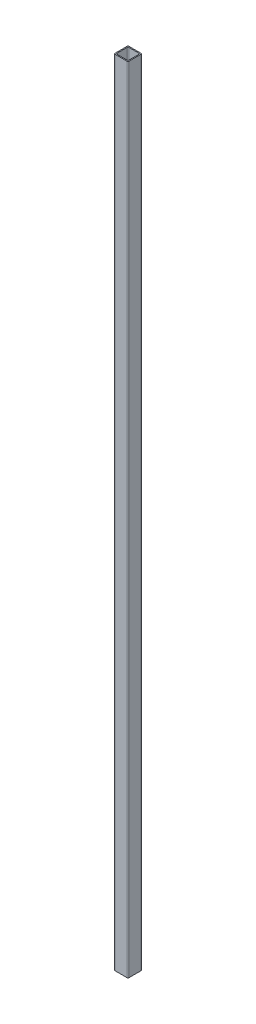
ISO-10303-21;
HEADER;
FILE_DESCRIPTION(('STEP AP214'),'2;1');
FILE_NAME('part.step','',(''),(''),'','','');
FILE_SCHEMA(('AUTOMOTIVE_DESIGN { 1 0 10303 214 1 1 1 1 }'));
ENDSEC;
DATA;
#1=APPLICATION_CONTEXT('core data for automotive mechanical design processes');
#2=APPLICATION_PROTOCOL_DEFINITION('international standard','automotive_design',2000,#1);
#3=PRODUCT_CONTEXT('',#1,'mechanical');
#4=PRODUCT('Part','Part','',(#3));
#5=PRODUCT_RELATED_PRODUCT_CATEGORY('part','',(#4));
#6=PRODUCT_DEFINITION_FORMATION('','',#4);
#7=PRODUCT_DEFINITION_CONTEXT('part definition',#1,'design');
#8=PRODUCT_DEFINITION('design','',#6,#7);
#9=PRODUCT_DEFINITION_SHAPE('','',#8);
#10=(LENGTH_UNIT() NAMED_UNIT(*) SI_UNIT(.MILLI.,.METRE.));
#11=(NAMED_UNIT(*) PLANE_ANGLE_UNIT() SI_UNIT($,.RADIAN.));
#12=(NAMED_UNIT(*) SI_UNIT($,.STERADIAN.) SOLID_ANGLE_UNIT());
#13=UNCERTAINTY_MEASURE_WITH_UNIT(LENGTH_MEASURE(1.E-05),#10,'distance_accuracy_value','');
#14=(GEOMETRIC_REPRESENTATION_CONTEXT(3) GLOBAL_UNCERTAINTY_ASSIGNED_CONTEXT((#13)) GLOBAL_UNIT_ASSIGNED_CONTEXT((#10,
#11,#12)) REPRESENTATION_CONTEXT('',''));
#15=CARTESIAN_POINT('',(0.,0.,0.));
#16=DIRECTION('',(0.,0.,1.));
#17=DIRECTION('',(1.,0.,0.));
#18=AXIS2_PLACEMENT_3D('',#15,#16,#17);
#19=CARTESIAN_POINT('',(-15.5,2000.,15.5));
#20=DIRECTION('',(0.,-1.,0.));
#21=DIRECTION('',(0.,0.,-1.));
#22=AXIS2_PLACEMENT_3D('',#19,#20,#21);
#23=CYLINDRICAL_SURFACE('',#22,2.);
#24=CARTESIAN_POINT('',(-15.5,0.,15.5));
#25=DIRECTION('',(0.,1.,0.));
#26=DIRECTION('',(0.,0.,1.));
#27=AXIS2_PLACEMENT_3D('',#24,#25,#26);
#28=CIRCLE('',#27,2.);
#29=CARTESIAN_POINT('',(-17.5,0.,15.5));
#30=VERTEX_POINT('',#29);
#31=CARTESIAN_POINT('',(-15.5,0.,17.5));
#32=VERTEX_POINT('',#31);
#33=EDGE_CURVE('E257',#30,#32,#28,.T.);
#34=ORIENTED_EDGE('',*,*,#33,.T.);
#35=DIRECTION('',(0.,-1.,0.));
#36=VECTOR('',#35,1.);
#37=CARTESIAN_POINT('',(-15.5,2000.,17.5));
#38=LINE('',#37,#36);
#39=CARTESIAN_POINT('',(-15.5,2000.,17.5));
#40=VERTEX_POINT('',#39);
#41=EDGE_CURVE('E12',#40,#32,#38,.T.);
#42=ORIENTED_EDGE('',*,*,#41,.F.);
#43=CARTESIAN_POINT('',(-15.5,2000.,15.5));
#44=DIRECTION('',(0.,1.,0.));
#45=DIRECTION('',(0.,0.,1.));
#46=AXIS2_PLACEMENT_3D('',#43,#44,#45);
#47=CIRCLE('',#46,2.);
#48=CARTESIAN_POINT('',(-17.5,2000.,15.5));
#49=VERTEX_POINT('',#48);
#50=EDGE_CURVE('E366',#49,#40,#47,.T.);
#51=ORIENTED_EDGE('',*,*,#50,.F.);
#52=DIRECTION('',(0.,-1.,0.));
#53=VECTOR('',#52,1.);
#54=CARTESIAN_POINT('',(-17.5,2000.,15.5));
#55=LINE('',#54,#53);
#56=EDGE_CURVE('E280',#49,#30,#55,.T.);
#57=ORIENTED_EDGE('',*,*,#56,.T.);
#58=EDGE_LOOP('',(#34,#42,#51,#57));
#59=FACE_BOUND('',#58,.T.);
#60=ADVANCED_FACE('F71',(#59),#23,.T.);
#61=CARTESIAN_POINT('',(-15.5,2000.,17.5));
#62=DIRECTION('',(0.,0.,-1.));
#63=DIRECTION('',(-1.,0.,0.));
#64=AXIS2_PLACEMENT_3D('',#61,#62,#63);
#65=PLANE('',#64);
#66=DIRECTION('',(1.,0.,0.));
#67=VECTOR('',#66,1.);
#68=CARTESIAN_POINT('',(-15.5,0.,17.5));
#69=LINE('',#68,#67);
#70=CARTESIAN_POINT('',(15.5,0.,17.5));
#71=VERTEX_POINT('',#70);
#72=EDGE_CURVE('E261',#32,#71,#69,.T.);
#73=ORIENTED_EDGE('',*,*,#72,.T.);
#74=DIRECTION('',(0.,-1.,0.));
#75=VECTOR('',#74,1.);
#76=CARTESIAN_POINT('',(15.5,2000.,17.5));
#77=LINE('',#76,#75);
#78=CARTESIAN_POINT('',(15.5,2000.,17.5));
#79=VERTEX_POINT('',#78);
#80=EDGE_CURVE('E82',#79,#71,#77,.T.);
#81=ORIENTED_EDGE('',*,*,#80,.F.);
#82=DIRECTION('',(1.,0.,0.));
#83=VECTOR('',#82,1.);
#84=CARTESIAN_POINT('',(-15.5,2000.,17.5));
#85=LINE('',#84,#83);
#86=EDGE_CURVE('E369',#40,#79,#85,.T.);
#87=ORIENTED_EDGE('',*,*,#86,.F.);
#88=ORIENTED_EDGE('',*,*,#41,.T.);
#89=EDGE_LOOP('',(#73,#81,#87,#88));
#90=FACE_BOUND('',#89,.T.);
#91=ADVANCED_FACE('F418',(#90),#65,.F.);
#92=CARTESIAN_POINT('',(15.5,2000.,15.5));
#93=DIRECTION('',(0.,-1.,0.));
#94=DIRECTION('',(0.,0.,-1.));
#95=AXIS2_PLACEMENT_3D('',#92,#93,#94);
#96=CYLINDRICAL_SURFACE('',#95,2.);
#97=CARTESIAN_POINT('',(15.5,0.,15.5));
#98=DIRECTION('',(0.,1.,0.));
#99=DIRECTION('',(0.,0.,-1.));
#100=AXIS2_PLACEMENT_3D('',#97,#98,#99);
#101=CIRCLE('',#100,2.);
#102=CARTESIAN_POINT('',(17.5,0.,15.5));
#103=VERTEX_POINT('',#102);
#104=EDGE_CURVE('E264',#71,#103,#101,.T.);
#105=ORIENTED_EDGE('',*,*,#104,.T.);
#106=DIRECTION('',(0.,-1.,0.));
#107=VECTOR('',#106,1.);
#108=CARTESIAN_POINT('',(17.5,2000.,15.5));
#109=LINE('',#108,#107);
#110=CARTESIAN_POINT('',(17.5,2000.,15.5));
#111=VERTEX_POINT('',#110);
#112=EDGE_CURVE('E291',#111,#103,#109,.T.);
#113=ORIENTED_EDGE('',*,*,#112,.F.);
#114=CARTESIAN_POINT('',(15.5,2000.,15.5));
#115=DIRECTION('',(0.,1.,0.));
#116=DIRECTION('',(0.,0.,-1.));
#117=AXIS2_PLACEMENT_3D('',#114,#115,#116);
#118=CIRCLE('',#117,2.);
#119=EDGE_CURVE('E372',#79,#111,#118,.T.);
#120=ORIENTED_EDGE('',*,*,#119,.F.);
#121=ORIENTED_EDGE('',*,*,#80,.T.);
#122=EDGE_LOOP('',(#105,#113,#120,#121));
#123=FACE_BOUND('',#122,.T.);
#124=ADVANCED_FACE('F423',(#123),#96,.T.);
#125=CARTESIAN_POINT('',(17.5,2000.,-15.5));
#126=DIRECTION('',(-1.,0.,0.));
#127=DIRECTION('',(0.,0.,1.));
#128=AXIS2_PLACEMENT_3D('',#125,#126,#127);
#129=PLANE('',#128);
#130=DIRECTION('',(0.,0.,-1.));
#131=VECTOR('',#130,1.);
#132=CARTESIAN_POINT('',(17.5,0.,-15.5));
#133=LINE('',#132,#131);
#134=CARTESIAN_POINT('',(17.5,0.,-15.5));
#135=VERTEX_POINT('',#134);
#136=EDGE_CURVE('E267',#103,#135,#133,.T.);
#137=ORIENTED_EDGE('',*,*,#136,.T.);
#138=DIRECTION('',(0.,-1.,0.));
#139=VECTOR('',#138,1.);
#140=CARTESIAN_POINT('',(17.5,2000.,-15.5));
#141=LINE('',#140,#139);
#142=CARTESIAN_POINT('',(17.5,2000.,-15.5));
#143=VERTEX_POINT('',#142);
#144=EDGE_CURVE('E287',#143,#135,#141,.T.);
#145=ORIENTED_EDGE('',*,*,#144,.F.);
#146=DIRECTION('',(0.,0.,-1.));
#147=VECTOR('',#146,1.);
#148=CARTESIAN_POINT('',(17.5,2000.,-15.5));
#149=LINE('',#148,#147);
#150=EDGE_CURVE('E375',#111,#143,#149,.T.);
#151=ORIENTED_EDGE('',*,*,#150,.F.);
#152=ORIENTED_EDGE('',*,*,#112,.T.);
#153=EDGE_LOOP('',(#137,#145,#151,#152));
#154=FACE_BOUND('',#153,.T.);
#155=ADVANCED_FACE('F393',(#154),#129,.F.);
#156=CARTESIAN_POINT('',(15.5,2000.,-15.5));
#157=DIRECTION('',(0.,-1.,0.));
#158=DIRECTION('',(0.,0.,-1.));
#159=AXIS2_PLACEMENT_3D('',#156,#157,#158);
#160=CYLINDRICAL_SURFACE('',#159,2.);
#161=CARTESIAN_POINT('',(15.5,0.,-15.5));
#162=DIRECTION('',(0.,1.,0.));
#163=DIRECTION('',(0.,0.,-1.));
#164=AXIS2_PLACEMENT_3D('',#161,#162,#163);
#165=CIRCLE('',#164,2.);
#166=CARTESIAN_POINT('',(15.5,0.,-17.5));
#167=VERTEX_POINT('',#166);
#168=EDGE_CURVE('E270',#135,#167,#165,.T.);
#169=ORIENTED_EDGE('',*,*,#168,.T.);
#170=DIRECTION('',(0.,-1.,0.));
#171=VECTOR('',#170,1.);
#172=CARTESIAN_POINT('',(15.5,2000.,-17.5));
#173=LINE('',#172,#171);
#174=CARTESIAN_POINT('',(15.5,2000.,-17.5));
#175=VERTEX_POINT('',#174);
#176=EDGE_CURVE('E213',#175,#167,#173,.T.);
#177=ORIENTED_EDGE('',*,*,#176,.F.);
#178=CARTESIAN_POINT('',(15.5,2000.,-15.5));
#179=DIRECTION('',(0.,1.,0.));
#180=DIRECTION('',(0.,0.,-1.));
#181=AXIS2_PLACEMENT_3D('',#178,#179,#180);
#182=CIRCLE('',#181,2.);
#183=EDGE_CURVE('E202',#143,#175,#182,.T.);
#184=ORIENTED_EDGE('',*,*,#183,.F.);
#185=ORIENTED_EDGE('',*,*,#144,.T.);
#186=EDGE_LOOP('',(#169,#177,#184,#185));
#187=FACE_BOUND('',#186,.T.);
#188=ADVANCED_FACE('F397',(#187),#160,.T.);
#189=CARTESIAN_POINT('',(-15.5,2000.,-17.5));
#190=DIRECTION('',(0.,0.,1.));
#191=DIRECTION('',(1.,0.,0.));
#192=AXIS2_PLACEMENT_3D('',#189,#190,#191);
#193=PLANE('',#192);
#194=DIRECTION('',(-1.,0.,0.));
#195=VECTOR('',#194,1.);
#196=CARTESIAN_POINT('',(-15.5,0.,-17.5));
#197=LINE('',#196,#195);
#198=CARTESIAN_POINT('',(-15.5,0.,-17.5));
#199=VERTEX_POINT('',#198);
#200=EDGE_CURVE('E211',#167,#199,#197,.T.);
#201=ORIENTED_EDGE('',*,*,#200,.T.);
#202=DIRECTION('',(0.,-1.,0.));
#203=VECTOR('',#202,1.);
#204=CARTESIAN_POINT('',(-15.5,2000.,-17.5));
#205=LINE('',#204,#203);
#206=CARTESIAN_POINT('',(-15.5,2000.,-17.5));
#207=VERTEX_POINT('',#206);
#208=EDGE_CURVE('E208',#207,#199,#205,.T.);
#209=ORIENTED_EDGE('',*,*,#208,.F.);
#210=DIRECTION('',(-1.,0.,0.));
#211=VECTOR('',#210,1.);
#212=CARTESIAN_POINT('',(-15.5,2000.,-17.5));
#213=LINE('',#212,#211);
#214=EDGE_CURVE('E196',#175,#207,#213,.T.);
#215=ORIENTED_EDGE('',*,*,#214,.F.);
#216=ORIENTED_EDGE('',*,*,#176,.T.);
#217=EDGE_LOOP('',(#201,#209,#215,#216));
#218=FACE_BOUND('',#217,.T.);
#219=ADVANCED_FACE('F209',(#218),#193,.F.);
#220=CARTESIAN_POINT('',(-15.5,2000.,-15.5));
#221=DIRECTION('',(0.,-1.,0.));
#222=DIRECTION('',(0.,0.,-1.));
#223=AXIS2_PLACEMENT_3D('',#220,#221,#222);
#224=CYLINDRICAL_SURFACE('',#223,2.);
#225=CARTESIAN_POINT('',(-15.5,0.,-15.5));
#226=DIRECTION('',(0.,1.,0.));
#227=DIRECTION('',(0.,0.,-1.));
#228=AXIS2_PLACEMENT_3D('',#225,#226,#227);
#229=CIRCLE('',#228,2.);
#230=CARTESIAN_POINT('',(-17.5,0.,-15.5));
#231=VERTEX_POINT('',#230);
#232=EDGE_CURVE('E144',#199,#231,#229,.T.);
#233=ORIENTED_EDGE('',*,*,#232,.T.);
#234=DIRECTION('',(0.,-1.,0.));
#235=VECTOR('',#234,1.);
#236=CARTESIAN_POINT('',(-17.5,2000.,-15.5));
#237=LINE('',#236,#235);
#238=CARTESIAN_POINT('',(-17.5,2000.,-15.5));
#239=VERTEX_POINT('',#238);
#240=EDGE_CURVE('E214',#239,#231,#237,.T.);
#241=ORIENTED_EDGE('',*,*,#240,.F.);
#242=CARTESIAN_POINT('',(-15.5,2000.,-15.5));
#243=DIRECTION('',(0.,1.,0.));
#244=DIRECTION('',(0.,0.,-1.));
#245=AXIS2_PLACEMENT_3D('',#242,#243,#244);
#246=CIRCLE('',#245,2.);
#247=EDGE_CURVE('E200',#207,#239,#246,.T.);
#248=ORIENTED_EDGE('',*,*,#247,.F.);
#249=ORIENTED_EDGE('',*,*,#208,.T.);
#250=EDGE_LOOP('',(#233,#241,#248,#249));
#251=FACE_BOUND('',#250,.T.);
#252=ADVANCED_FACE('F216',(#251),#224,.T.);
#253=CARTESIAN_POINT('',(-13.,2000.,13.));
#254=DIRECTION('',(0.,-1.,0.));
#255=DIRECTION('',(0.,0.,-1.));
#256=AXIS2_PLACEMENT_3D('',#253,#254,#255);
#257=CYLINDRICAL_SURFACE('',#256,2.);
#258=CARTESIAN_POINT('',(-13.,0.,13.));
#259=DIRECTION('',(0.,1.,0.));
#260=DIRECTION('',(0.,0.,1.));
#261=AXIS2_PLACEMENT_3D('',#258,#259,#260);
#262=CIRCLE('',#261,2.);
#263=CARTESIAN_POINT('',(-15.,0.,13.));
#264=VERTEX_POINT('',#263);
#265=CARTESIAN_POINT('',(-13.,0.,15.));
#266=VERTEX_POINT('',#265);
#267=EDGE_CURVE('E225',#264,#266,#262,.T.);
#268=ORIENTED_EDGE('',*,*,#267,.F.);
#269=DIRECTION('',(0.,-1.,0.));
#270=VECTOR('',#269,1.);
#271=CARTESIAN_POINT('',(-15.,2000.,13.));
#272=LINE('',#271,#270);
#273=CARTESIAN_POINT('',(-15.,2000.,13.));
#274=VERTEX_POINT('',#273);
#275=EDGE_CURVE('E75',#274,#264,#272,.T.);
#276=ORIENTED_EDGE('',*,*,#275,.F.);
#277=CARTESIAN_POINT('',(-13.,2000.,13.));
#278=DIRECTION('',(0.,1.,0.));
#279=DIRECTION('',(0.,0.,1.));
#280=AXIS2_PLACEMENT_3D('',#277,#278,#279);
#281=CIRCLE('',#280,2.);
#282=CARTESIAN_POINT('',(-13.,2000.,15.));
#283=VERTEX_POINT('',#282);
#284=EDGE_CURVE('E279',#274,#283,#281,.T.);
#285=ORIENTED_EDGE('',*,*,#284,.T.);
#286=DIRECTION('',(0.,-1.,0.));
#287=VECTOR('',#286,1.);
#288=CARTESIAN_POINT('',(-13.,2000.,15.));
#289=LINE('',#288,#287);
#290=EDGE_CURVE('E221',#283,#266,#289,.T.);
#291=ORIENTED_EDGE('',*,*,#290,.T.);
#292=EDGE_LOOP('',(#268,#276,#285,#291));
#293=FACE_BOUND('',#292,.T.);
#294=ADVANCED_FACE('F73',(#293),#257,.F.);
#295=CARTESIAN_POINT('',(-15.,2000.,-13.));
#296=DIRECTION('',(1.,0.,0.));
#297=DIRECTION('',(0.,0.,-1.));
#298=AXIS2_PLACEMENT_3D('',#295,#296,#297);
#299=PLANE('',#298);
#300=DIRECTION('',(0.,0.,1.));
#301=VECTOR('',#300,1.);
#302=CARTESIAN_POINT('',(-15.,0.,-13.));
#303=LINE('',#302,#301);
#304=CARTESIAN_POINT('',(-15.,0.,-13.));
#305=VERTEX_POINT('',#304);
#306=EDGE_CURVE('E229',#305,#264,#303,.T.);
#307=ORIENTED_EDGE('',*,*,#306,.F.);
#308=DIRECTION('',(0.,-1.,0.));
#309=VECTOR('',#308,1.);
#310=CARTESIAN_POINT('',(-15.,2000.,-13.));
#311=LINE('',#310,#309);
#312=CARTESIAN_POINT('',(-15.,2000.,-13.));
#313=VERTEX_POINT('',#312);
#314=EDGE_CURVE('E314',#313,#305,#311,.T.);
#315=ORIENTED_EDGE('',*,*,#314,.F.);
#316=DIRECTION('',(0.,0.,1.));
#317=VECTOR('',#316,1.);
#318=CARTESIAN_POINT('',(-15.,2000.,-13.));
#319=LINE('',#318,#317);
#320=EDGE_CURVE('E327',#313,#274,#319,.T.);
#321=ORIENTED_EDGE('',*,*,#320,.T.);
#322=ORIENTED_EDGE('',*,*,#275,.T.);
#323=EDGE_LOOP('',(#307,#315,#321,#322));
#324=FACE_BOUND('',#323,.T.);
#325=ADVANCED_FACE('F325',(#324),#299,.T.);
#326=CARTESIAN_POINT('',(-13.,2000.,-13.));
#327=DIRECTION('',(0.,-1.,0.));
#328=DIRECTION('',(0.,0.,-1.));
#329=AXIS2_PLACEMENT_3D('',#326,#327,#328);
#330=CYLINDRICAL_SURFACE('',#329,2.);
#331=CARTESIAN_POINT('',(-13.,0.,-13.));
#332=DIRECTION('',(0.,1.,0.));
#333=DIRECTION('',(0.,0.,-1.));
#334=AXIS2_PLACEMENT_3D('',#331,#332,#333);
#335=CIRCLE('',#334,2.);
#336=CARTESIAN_POINT('',(-13.,0.,-15.));
#337=VERTEX_POINT('',#336);
#338=EDGE_CURVE('E233',#337,#305,#335,.T.);
#339=ORIENTED_EDGE('',*,*,#338,.F.);
#340=DIRECTION('',(0.,-1.,0.));
#341=VECTOR('',#340,1.);
#342=CARTESIAN_POINT('',(-13.,2000.,-15.));
#343=LINE('',#342,#341);
#344=CARTESIAN_POINT('',(-13.,2000.,-15.));
#345=VERTEX_POINT('',#344);
#346=EDGE_CURVE('E312',#345,#337,#343,.T.);
#347=ORIENTED_EDGE('',*,*,#346,.F.);
#348=CARTESIAN_POINT('',(-13.,2000.,-13.));
#349=DIRECTION('',(0.,1.,0.));
#350=DIRECTION('',(0.,0.,-1.));
#351=AXIS2_PLACEMENT_3D('',#348,#349,#350);
#352=CIRCLE('',#351,2.);
#353=EDGE_CURVE('E335',#345,#313,#352,.T.);
#354=ORIENTED_EDGE('',*,*,#353,.T.);
#355=ORIENTED_EDGE('',*,*,#314,.T.);
#356=EDGE_LOOP('',(#339,#347,#354,#355));
#357=FACE_BOUND('',#356,.T.);
#358=ADVANCED_FACE('F333',(#357),#330,.F.);
#359=CARTESIAN_POINT('',(-13.,2000.,-15.));
#360=DIRECTION('',(0.,0.,1.));
#361=DIRECTION('',(1.,0.,0.));
#362=AXIS2_PLACEMENT_3D('',#359,#360,#361);
#363=PLANE('',#362);
#364=DIRECTION('',(-1.,0.,0.));
#365=VECTOR('',#364,1.);
#366=CARTESIAN_POINT('',(-13.,0.,-15.));
#367=LINE('',#366,#365);
#368=CARTESIAN_POINT('',(13.,0.,-15.));
#369=VERTEX_POINT('',#368);
#370=EDGE_CURVE('E237',#369,#337,#367,.T.);
#371=ORIENTED_EDGE('',*,*,#370,.F.);
#372=DIRECTION('',(0.,-1.,0.));
#373=VECTOR('',#372,1.);
#374=CARTESIAN_POINT('',(13.,2000.,-15.));
#375=LINE('',#374,#373);
#376=CARTESIAN_POINT('',(13.,2000.,-15.));
#377=VERTEX_POINT('',#376);
#378=EDGE_CURVE('E309',#377,#369,#375,.T.);
#379=ORIENTED_EDGE('',*,*,#378,.F.);
#380=DIRECTION('',(-1.,0.,0.));
#381=VECTOR('',#380,1.);
#382=CARTESIAN_POINT('',(-13.,2000.,-15.));
#383=LINE('',#382,#381);
#384=EDGE_CURVE('E341',#377,#345,#383,.T.);
#385=ORIENTED_EDGE('',*,*,#384,.T.);
#386=ORIENTED_EDGE('',*,*,#346,.T.);
#387=EDGE_LOOP('',(#371,#379,#385,#386));
#388=FACE_BOUND('',#387,.T.);
#389=ADVANCED_FACE('F345',(#388),#363,.T.);
#390=CARTESIAN_POINT('',(13.,2000.,-13.));
#391=DIRECTION('',(0.,-1.,0.));
#392=DIRECTION('',(0.,0.,-1.));
#393=AXIS2_PLACEMENT_3D('',#390,#391,#392);
#394=CYLINDRICAL_SURFACE('',#393,2.);
#395=CARTESIAN_POINT('',(13.,0.,-13.));
#396=DIRECTION('',(0.,1.,0.));
#397=DIRECTION('',(0.,0.,-1.));
#398=AXIS2_PLACEMENT_3D('',#395,#396,#397);
#399=CIRCLE('',#398,2.);
#400=CARTESIAN_POINT('',(15.,0.,-13.));
#401=VERTEX_POINT('',#400);
#402=EDGE_CURVE('E241',#401,#369,#399,.T.);
#403=ORIENTED_EDGE('',*,*,#402,.F.);
#404=DIRECTION('',(0.,-1.,0.));
#405=VECTOR('',#404,1.);
#406=CARTESIAN_POINT('',(15.,2000.,-13.));
#407=LINE('',#406,#405);
#408=CARTESIAN_POINT('',(15.,2000.,-13.));
#409=VERTEX_POINT('',#408);
#410=EDGE_CURVE('E306',#409,#401,#407,.T.);
#411=ORIENTED_EDGE('',*,*,#410,.F.);
#412=CARTESIAN_POINT('',(13.,2000.,-13.));
#413=DIRECTION('',(0.,1.,0.));
#414=DIRECTION('',(0.,0.,-1.));
#415=AXIS2_PLACEMENT_3D('',#412,#413,#414);
#416=CIRCLE('',#415,2.);
#417=EDGE_CURVE('E347',#409,#377,#416,.T.);
#418=ORIENTED_EDGE('',*,*,#417,.T.);
#419=ORIENTED_EDGE('',*,*,#378,.T.);
#420=EDGE_LOOP('',(#403,#411,#418,#419));
#421=FACE_BOUND('',#420,.T.);
#422=ADVANCED_FACE('F434',(#421),#394,.F.);
#423=CARTESIAN_POINT('',(15.,2000.,-13.));
#424=DIRECTION('',(-1.,0.,0.));
#425=DIRECTION('',(0.,0.,1.));
#426=AXIS2_PLACEMENT_3D('',#423,#424,#425);
#427=PLANE('',#426);
#428=DIRECTION('',(0.,0.,-1.));
#429=VECTOR('',#428,1.);
#430=CARTESIAN_POINT('',(15.,0.,-13.));
#431=LINE('',#430,#429);
#432=CARTESIAN_POINT('',(15.,0.,13.));
#433=VERTEX_POINT('',#432);
#434=EDGE_CURVE('E245',#433,#401,#431,.T.);
#435=ORIENTED_EDGE('',*,*,#434,.F.);
#436=DIRECTION('',(0.,-1.,0.));
#437=VECTOR('',#436,1.);
#438=CARTESIAN_POINT('',(15.,2000.,13.));
#439=LINE('',#438,#437);
#440=CARTESIAN_POINT('',(15.,2000.,13.));
#441=VERTEX_POINT('',#440);
#442=EDGE_CURVE('E303',#441,#433,#439,.T.);
#443=ORIENTED_EDGE('',*,*,#442,.F.);
#444=DIRECTION('',(0.,0.,-1.));
#445=VECTOR('',#444,1.);
#446=CARTESIAN_POINT('',(15.,2000.,-13.));
#447=LINE('',#446,#445);
#448=EDGE_CURVE('E351',#441,#409,#447,.T.);
#449=ORIENTED_EDGE('',*,*,#448,.T.);
#450=ORIENTED_EDGE('',*,*,#410,.T.);
#451=EDGE_LOOP('',(#435,#443,#449,#450));
#452=FACE_BOUND('',#451,.T.);
#453=ADVANCED_FACE('F430',(#452),#427,.T.);
#454=CARTESIAN_POINT('',(13.,2000.,13.));
#455=DIRECTION('',(0.,-1.,0.));
#456=DIRECTION('',(0.,0.,-1.));
#457=AXIS2_PLACEMENT_3D('',#454,#455,#456);
#458=CYLINDRICAL_SURFACE('',#457,2.);
#459=CARTESIAN_POINT('',(13.,0.,13.));
#460=DIRECTION('',(0.,1.,0.));
#461=DIRECTION('',(0.,0.,-1.));
#462=AXIS2_PLACEMENT_3D('',#459,#460,#461);
#463=CIRCLE('',#462,2.);
#464=CARTESIAN_POINT('',(13.,0.,15.));
#465=VERTEX_POINT('',#464);
#466=EDGE_CURVE('E249',#465,#433,#463,.T.);
#467=ORIENTED_EDGE('',*,*,#466,.F.);
#468=DIRECTION('',(0.,-1.,0.));
#469=VECTOR('',#468,1.);
#470=CARTESIAN_POINT('',(13.,2000.,15.));
#471=LINE('',#470,#469);
#472=CARTESIAN_POINT('',(13.,2000.,15.));
#473=VERTEX_POINT('',#472);
#474=EDGE_CURVE('E300',#473,#465,#471,.T.);
#475=ORIENTED_EDGE('',*,*,#474,.F.);
#476=CARTESIAN_POINT('',(13.,2000.,13.));
#477=DIRECTION('',(0.,1.,0.));
#478=DIRECTION('',(0.,0.,-1.));
#479=AXIS2_PLACEMENT_3D('',#476,#477,#478);
#480=CIRCLE('',#479,2.);
#481=EDGE_CURVE('E358',#473,#441,#480,.T.);
#482=ORIENTED_EDGE('',*,*,#481,.T.);
#483=ORIENTED_EDGE('',*,*,#442,.T.);
#484=EDGE_LOOP('',(#467,#475,#482,#483));
#485=FACE_BOUND('',#484,.T.);
#486=ADVANCED_FACE('F412',(#485),#458,.F.);
#487=CARTESIAN_POINT('',(-13.,2000.,15.));
#488=DIRECTION('',(0.,0.,-1.));
#489=DIRECTION('',(-1.,0.,0.));
#490=AXIS2_PLACEMENT_3D('',#487,#488,#489);
#491=PLANE('',#490);
#492=DIRECTION('',(1.,0.,0.));
#493=VECTOR('',#492,1.);
#494=CARTESIAN_POINT('',(-13.,0.,15.));
#495=LINE('',#494,#493);
#496=EDGE_CURVE('E253',#266,#465,#495,.T.);
#497=ORIENTED_EDGE('',*,*,#496,.F.);
#498=ORIENTED_EDGE('',*,*,#290,.F.);
#499=DIRECTION('',(1.,0.,0.));
#500=VECTOR('',#499,1.);
#501=CARTESIAN_POINT('',(-13.,2000.,15.));
#502=LINE('',#501,#500);
#503=EDGE_CURVE('E362',#283,#473,#502,.T.);
#504=ORIENTED_EDGE('',*,*,#503,.T.);
#505=ORIENTED_EDGE('',*,*,#474,.T.);
#506=EDGE_LOOP('',(#497,#498,#504,#505));
#507=FACE_BOUND('',#506,.T.);
#508=ADVANCED_FACE('F405',(#507),#491,.T.);
#509=CARTESIAN_POINT('',(-17.5,2000.,-15.5));
#510=DIRECTION('',(1.,0.,0.));
#511=DIRECTION('',(0.,0.,-1.));
#512=AXIS2_PLACEMENT_3D('',#509,#510,#511);
#513=PLANE('',#512);
#514=DIRECTION('',(0.,0.,1.));
#515=VECTOR('',#514,1.);
#516=CARTESIAN_POINT('',(-17.5,0.,-15.5));
#517=LINE('',#516,#515);
#518=EDGE_CURVE('E150',#231,#30,#517,.T.);
#519=ORIENTED_EDGE('',*,*,#518,.T.);
#520=ORIENTED_EDGE('',*,*,#56,.F.);
#521=DIRECTION('',(0.,0.,1.));
#522=VECTOR('',#521,1.);
#523=CARTESIAN_POINT('',(-17.5,2000.,-15.5));
#524=LINE('',#523,#522);
#525=EDGE_CURVE('E91',#239,#49,#524,.T.);
#526=ORIENTED_EDGE('',*,*,#525,.F.);
#527=ORIENTED_EDGE('',*,*,#240,.T.);
#528=EDGE_LOOP('',(#519,#520,#526,#527));
#529=FACE_BOUND('',#528,.T.);
#530=ADVANCED_FACE('F403',(#529),#513,.F.);
#531=CARTESIAN_POINT('',(-15.5,2000.,15.5));
#532=DIRECTION('',(0.,1.,0.));
#533=DIRECTION('',(0.,0.,1.));
#534=AXIS2_PLACEMENT_3D('',#531,#532,#533);
#535=PLANE('',#534);
#536=ORIENTED_EDGE('',*,*,#284,.F.);
#537=ORIENTED_EDGE('',*,*,#320,.F.);
#538=ORIENTED_EDGE('',*,*,#353,.F.);
#539=ORIENTED_EDGE('',*,*,#384,.F.);
#540=ORIENTED_EDGE('',*,*,#417,.F.);
#541=ORIENTED_EDGE('',*,*,#448,.F.);
#542=ORIENTED_EDGE('',*,*,#481,.F.);
#543=ORIENTED_EDGE('',*,*,#503,.F.);
#544=EDGE_LOOP('',(#536,#537,#538,#539,#540,#541,#542,#543));
#545=FACE_BOUND('',#544,.T.);
#546=ORIENTED_EDGE('',*,*,#50,.T.);
#547=ORIENTED_EDGE('',*,*,#86,.T.);
#548=ORIENTED_EDGE('',*,*,#119,.T.);
#549=ORIENTED_EDGE('',*,*,#150,.T.);
#550=ORIENTED_EDGE('',*,*,#183,.T.);
#551=ORIENTED_EDGE('',*,*,#214,.T.);
#552=ORIENTED_EDGE('',*,*,#247,.T.);
#553=ORIENTED_EDGE('',*,*,#525,.T.);
#554=EDGE_LOOP('',(#546,#547,#548,#549,#550,#551,#552,#553));
#555=FACE_BOUND('',#554,.T.);
#556=ADVANCED_FACE('F198',(#545,#555),#535,.T.);
#557=CARTESIAN_POINT('',(-15.5,0.,15.5));
#558=DIRECTION('',(0.,1.,0.));
#559=DIRECTION('',(0.,0.,1.));
#560=AXIS2_PLACEMENT_3D('',#557,#558,#559);
#561=PLANE('',#560);
#562=ORIENTED_EDGE('',*,*,#267,.T.);
#563=ORIENTED_EDGE('',*,*,#496,.T.);
#564=ORIENTED_EDGE('',*,*,#466,.T.);
#565=ORIENTED_EDGE('',*,*,#434,.T.);
#566=ORIENTED_EDGE('',*,*,#402,.T.);
#567=ORIENTED_EDGE('',*,*,#370,.T.);
#568=ORIENTED_EDGE('',*,*,#338,.T.);
#569=ORIENTED_EDGE('',*,*,#306,.T.);
#570=EDGE_LOOP('',(#562,#563,#564,#565,#566,#567,#568,#569));
#571=FACE_BOUND('',#570,.T.);
#572=ORIENTED_EDGE('',*,*,#33,.F.);
#573=ORIENTED_EDGE('',*,*,#518,.F.);
#574=ORIENTED_EDGE('',*,*,#232,.F.);
#575=ORIENTED_EDGE('',*,*,#200,.F.);
#576=ORIENTED_EDGE('',*,*,#168,.F.);
#577=ORIENTED_EDGE('',*,*,#136,.F.);
#578=ORIENTED_EDGE('',*,*,#104,.F.);
#579=ORIENTED_EDGE('',*,*,#72,.F.);
#580=EDGE_LOOP('',(#572,#573,#574,#575,#576,#577,#578,#579));
#581=FACE_BOUND('',#580,.T.);
#582=ADVANCED_FACE('F330',(#571,#581),#561,.F.);
#583=CLOSED_SHELL('',(#60,#91,#124,#155,#188,#219,#252,#294,#325,#358,#389,#422,#453,#486,#508,
#530,#556,#582));
#584=MANIFOLD_SOLID_BREP('B2',#583);
#585=ADVANCED_BREP_SHAPE_REPRESENTATION('',(#18,#584),#14);
#586=SHAPE_DEFINITION_REPRESENTATION(#9,#585);
ENDSEC;
END-ISO-10303-21;
